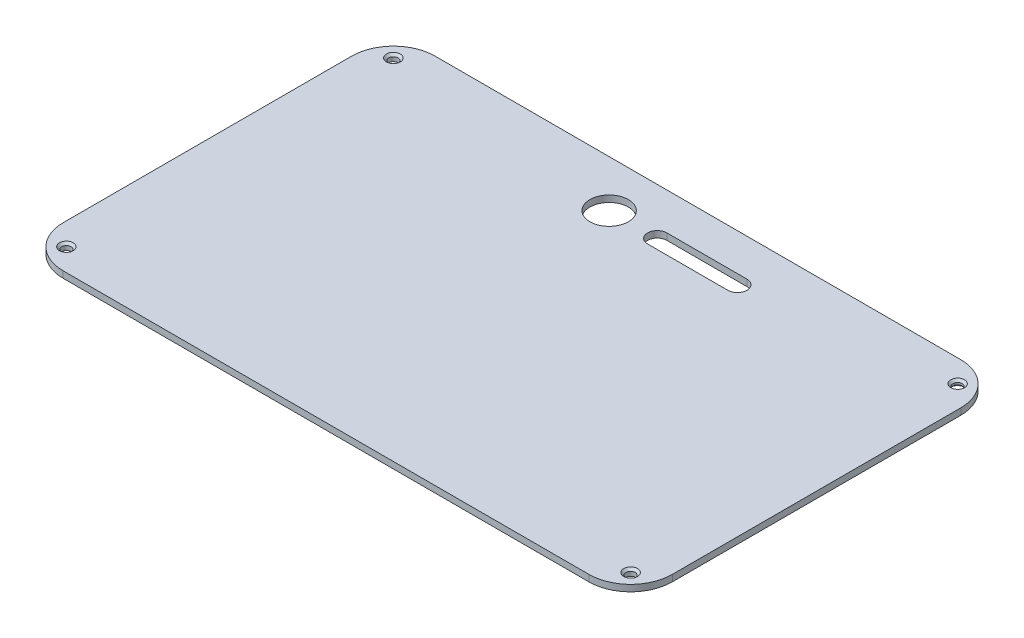
ISO-10303-21;
HEADER;
FILE_DESCRIPTION(('STEP AP214'),'2;1');
FILE_NAME('part.step','',(''),(''),'','','');
FILE_SCHEMA(('AUTOMOTIVE_DESIGN { 1 0 10303 214 1 1 1 1 }'));
ENDSEC;
DATA;
#1=APPLICATION_CONTEXT('core data for automotive mechanical design processes');
#2=APPLICATION_PROTOCOL_DEFINITION('international standard','automotive_design',2000,#1);
#3=PRODUCT_CONTEXT('',#1,'mechanical');
#4=PRODUCT('Part','Part','',(#3));
#5=PRODUCT_RELATED_PRODUCT_CATEGORY('part','',(#4));
#6=PRODUCT_DEFINITION_FORMATION('','',#4);
#7=PRODUCT_DEFINITION_CONTEXT('part definition',#1,'design');
#8=PRODUCT_DEFINITION('design','',#6,#7);
#9=PRODUCT_DEFINITION_SHAPE('','',#8);
#10=(LENGTH_UNIT() NAMED_UNIT(*) SI_UNIT(.MILLI.,.METRE.));
#11=(NAMED_UNIT(*) PLANE_ANGLE_UNIT() SI_UNIT($,.RADIAN.));
#12=(NAMED_UNIT(*) SI_UNIT($,.STERADIAN.) SOLID_ANGLE_UNIT());
#13=UNCERTAINTY_MEASURE_WITH_UNIT(LENGTH_MEASURE(1.E-05),#10,'distance_accuracy_value','');
#14=(GEOMETRIC_REPRESENTATION_CONTEXT(3) GLOBAL_UNCERTAINTY_ASSIGNED_CONTEXT((#13)) GLOBAL_UNIT_ASSIGNED_CONTEXT((#10,
#11,#12)) REPRESENTATION_CONTEXT('',''));
#15=CARTESIAN_POINT('',(0.,0.,0.));
#16=DIRECTION('',(0.,0.,1.));
#17=DIRECTION('',(1.,0.,0.));
#18=AXIS2_PLACEMENT_3D('',#15,#16,#17);
#19=CARTESIAN_POINT('',(-82.,1.016,45.));
#20=DIRECTION('',(0.,-1.,0.));
#21=DIRECTION('',(0.,0.,-1.));
#22=AXIS2_PLACEMENT_3D('',#19,#20,#21);
#23=CYLINDRICAL_SURFACE('',#22,13.);
#24=CARTESIAN_POINT('',(-82.,-1.016,45.));
#25=DIRECTION('',(0.,1.,0.));
#26=DIRECTION('',(0.,0.,-1.));
#27=AXIS2_PLACEMENT_3D('',#24,#25,#26);
#28=CIRCLE('',#27,13.);
#29=CARTESIAN_POINT('',(-95.,-1.016,45.));
#30=VERTEX_POINT('',#29);
#31=CARTESIAN_POINT('',(-82.,-1.016,58.));
#32=VERTEX_POINT('',#31);
#33=EDGE_CURVE('E176',#30,#32,#28,.T.);
#34=ORIENTED_EDGE('',*,*,#33,.T.);
#35=DIRECTION('',(0.,-1.,0.));
#36=VECTOR('',#35,1.);
#37=CARTESIAN_POINT('',(-82.,1.016,58.));
#38=LINE('',#37,#36);
#39=CARTESIAN_POINT('',(-82.,1.016,58.));
#40=VERTEX_POINT('',#39);
#41=EDGE_CURVE('E231',#40,#32,#38,.T.);
#42=ORIENTED_EDGE('',*,*,#41,.F.);
#43=CARTESIAN_POINT('',(-82.,1.016,45.));
#44=DIRECTION('',(0.,1.,0.));
#45=DIRECTION('',(0.,0.,-1.));
#46=AXIS2_PLACEMENT_3D('',#43,#44,#45);
#47=CIRCLE('',#46,13.);
#48=CARTESIAN_POINT('',(-95.,1.016,45.));
#49=VERTEX_POINT('',#48);
#50=EDGE_CURVE('E177',#49,#40,#47,.T.);
#51=ORIENTED_EDGE('',*,*,#50,.F.);
#52=DIRECTION('',(0.,-1.,0.));
#53=VECTOR('',#52,1.);
#54=CARTESIAN_POINT('',(-95.,1.016,45.));
#55=LINE('',#54,#53);
#56=EDGE_CURVE('E195',#49,#30,#55,.T.);
#57=ORIENTED_EDGE('',*,*,#56,.T.);
#58=EDGE_LOOP('',(#34,#42,#51,#57));
#59=FACE_BOUND('',#58,.T.);
#60=ADVANCED_FACE('F35',(#59),#23,.T.);
#61=CARTESIAN_POINT('',(-82.,1.016,58.));
#62=DIRECTION('',(0.,0.,-1.));
#63=DIRECTION('',(-1.,0.,0.));
#64=AXIS2_PLACEMENT_3D('',#61,#62,#63);
#65=PLANE('',#64);
#66=DIRECTION('',(1.,0.,0.));
#67=VECTOR('',#66,1.);
#68=CARTESIAN_POINT('',(-82.,-1.016,58.));
#69=LINE('',#68,#67);
#70=CARTESIAN_POINT('',(82.,-1.016,58.));
#71=VERTEX_POINT('',#70);
#72=EDGE_CURVE('E198',#32,#71,#69,.T.);
#73=ORIENTED_EDGE('',*,*,#72,.T.);
#74=DIRECTION('',(0.,-1.,0.));
#75=VECTOR('',#74,1.);
#76=CARTESIAN_POINT('',(82.,1.016,58.));
#77=LINE('',#76,#75);
#78=CARTESIAN_POINT('',(82.,1.016,58.));
#79=VERTEX_POINT('',#78);
#80=EDGE_CURVE('E228',#79,#71,#77,.T.);
#81=ORIENTED_EDGE('',*,*,#80,.F.);
#82=DIRECTION('',(1.,0.,0.));
#83=VECTOR('',#82,1.);
#84=CARTESIAN_POINT('',(-82.,1.016,58.));
#85=LINE('',#84,#83);
#86=EDGE_CURVE('E180',#40,#79,#85,.T.);
#87=ORIENTED_EDGE('',*,*,#86,.F.);
#88=ORIENTED_EDGE('',*,*,#41,.T.);
#89=EDGE_LOOP('',(#73,#81,#87,#88));
#90=FACE_BOUND('',#89,.T.);
#91=ADVANCED_FACE('F279',(#90),#65,.F.);
#92=CARTESIAN_POINT('',(82.,1.016,45.));
#93=DIRECTION('',(0.,-1.,0.));
#94=DIRECTION('',(0.,0.,-1.));
#95=AXIS2_PLACEMENT_3D('',#92,#93,#94);
#96=CYLINDRICAL_SURFACE('',#95,13.);
#97=CARTESIAN_POINT('',(82.,-1.016,45.));
#98=DIRECTION('',(0.,1.,0.));
#99=DIRECTION('',(0.,0.,1.));
#100=AXIS2_PLACEMENT_3D('',#97,#98,#99);
#101=CIRCLE('',#100,13.);
#102=CARTESIAN_POINT('',(95.,-1.016,45.));
#103=VERTEX_POINT('',#102);
#104=EDGE_CURVE('E200',#71,#103,#101,.T.);
#105=ORIENTED_EDGE('',*,*,#104,.T.);
#106=DIRECTION('',(0.,-1.,0.));
#107=VECTOR('',#106,1.);
#108=CARTESIAN_POINT('',(95.,1.016,45.));
#109=LINE('',#108,#107);
#110=CARTESIAN_POINT('',(95.,1.016,45.));
#111=VERTEX_POINT('',#110);
#112=EDGE_CURVE('E225',#111,#103,#109,.T.);
#113=ORIENTED_EDGE('',*,*,#112,.F.);
#114=CARTESIAN_POINT('',(82.,1.016,45.));
#115=DIRECTION('',(0.,1.,0.));
#116=DIRECTION('',(0.,0.,1.));
#117=AXIS2_PLACEMENT_3D('',#114,#115,#116);
#118=CIRCLE('',#117,13.);
#119=EDGE_CURVE('E183',#79,#111,#118,.T.);
#120=ORIENTED_EDGE('',*,*,#119,.F.);
#121=ORIENTED_EDGE('',*,*,#80,.T.);
#122=EDGE_LOOP('',(#105,#113,#120,#121));
#123=FACE_BOUND('',#122,.T.);
#124=ADVANCED_FACE('F285',(#123),#96,.T.);
#125=CARTESIAN_POINT('',(95.,1.016,45.));
#126=DIRECTION('',(-1.,0.,0.));
#127=DIRECTION('',(0.,0.,1.));
#128=AXIS2_PLACEMENT_3D('',#125,#126,#127);
#129=PLANE('',#128);
#130=DIRECTION('',(0.,0.,-1.));
#131=VECTOR('',#130,1.);
#132=CARTESIAN_POINT('',(95.,-1.016,45.));
#133=LINE('',#132,#131);
#134=CARTESIAN_POINT('',(95.,-1.016,-45.));
#135=VERTEX_POINT('',#134);
#136=EDGE_CURVE('E202',#103,#135,#133,.T.);
#137=ORIENTED_EDGE('',*,*,#136,.T.);
#138=DIRECTION('',(0.,-1.,0.));
#139=VECTOR('',#138,1.);
#140=CARTESIAN_POINT('',(95.,1.016,-45.));
#141=LINE('',#140,#139);
#142=CARTESIAN_POINT('',(95.,1.016,-45.));
#143=VERTEX_POINT('',#142);
#144=EDGE_CURVE('E222',#143,#135,#141,.T.);
#145=ORIENTED_EDGE('',*,*,#144,.F.);
#146=DIRECTION('',(0.,0.,-1.));
#147=VECTOR('',#146,1.);
#148=CARTESIAN_POINT('',(95.,1.016,45.));
#149=LINE('',#148,#147);
#150=EDGE_CURVE('E185',#111,#143,#149,.T.);
#151=ORIENTED_EDGE('',*,*,#150,.F.);
#152=ORIENTED_EDGE('',*,*,#112,.T.);
#153=EDGE_LOOP('',(#137,#145,#151,#152));
#154=FACE_BOUND('',#153,.T.);
#155=ADVANCED_FACE('F355',(#154),#129,.F.);
#156=CARTESIAN_POINT('',(82.,1.016,-45.));
#157=DIRECTION('',(0.,-1.,0.));
#158=DIRECTION('',(0.,0.,-1.));
#159=AXIS2_PLACEMENT_3D('',#156,#157,#158);
#160=CYLINDRICAL_SURFACE('',#159,13.);
#161=CARTESIAN_POINT('',(82.,-1.016,-45.));
#162=DIRECTION('',(0.,1.,0.));
#163=DIRECTION('',(0.,0.,-1.));
#164=AXIS2_PLACEMENT_3D('',#161,#162,#163);
#165=CIRCLE('',#164,13.);
#166=CARTESIAN_POINT('',(82.,-1.016,-58.));
#167=VERTEX_POINT('',#166);
#168=EDGE_CURVE('E204',#135,#167,#165,.T.);
#169=ORIENTED_EDGE('',*,*,#168,.T.);
#170=DIRECTION('',(0.,-1.,0.));
#171=VECTOR('',#170,1.);
#172=CARTESIAN_POINT('',(82.,1.016,-58.));
#173=LINE('',#172,#171);
#174=CARTESIAN_POINT('',(82.,1.016,-58.));
#175=VERTEX_POINT('',#174);
#176=EDGE_CURVE('E219',#175,#167,#173,.T.);
#177=ORIENTED_EDGE('',*,*,#176,.F.);
#178=CARTESIAN_POINT('',(82.,1.016,-45.));
#179=DIRECTION('',(0.,1.,0.));
#180=DIRECTION('',(0.,0.,-1.));
#181=AXIS2_PLACEMENT_3D('',#178,#179,#180);
#182=CIRCLE('',#181,13.);
#183=EDGE_CURVE('E187',#143,#175,#182,.T.);
#184=ORIENTED_EDGE('',*,*,#183,.F.);
#185=ORIENTED_EDGE('',*,*,#144,.T.);
#186=EDGE_LOOP('',(#169,#177,#184,#185));
#187=FACE_BOUND('',#186,.T.);
#188=ADVANCED_FACE('F351',(#187),#160,.T.);
#189=CARTESIAN_POINT('',(-82.,1.016,-58.));
#190=DIRECTION('',(0.,0.,1.));
#191=DIRECTION('',(1.,0.,0.));
#192=AXIS2_PLACEMENT_3D('',#189,#190,#191);
#193=PLANE('',#192);
#194=DIRECTION('',(-1.,0.,0.));
#195=VECTOR('',#194,1.);
#196=CARTESIAN_POINT('',(-82.,-1.016,-58.));
#197=LINE('',#196,#195);
#198=CARTESIAN_POINT('',(-82.,-1.016,-58.));
#199=VERTEX_POINT('',#198);
#200=EDGE_CURVE('E206',#167,#199,#197,.T.);
#201=ORIENTED_EDGE('',*,*,#200,.T.);
#202=DIRECTION('',(0.,-1.,0.));
#203=VECTOR('',#202,1.);
#204=CARTESIAN_POINT('',(-82.,1.016,-58.));
#205=LINE('',#204,#203);
#206=CARTESIAN_POINT('',(-82.,1.016,-58.));
#207=VERTEX_POINT('',#206);
#208=EDGE_CURVE('E216',#207,#199,#205,.T.);
#209=ORIENTED_EDGE('',*,*,#208,.F.);
#210=DIRECTION('',(-1.,0.,0.));
#211=VECTOR('',#210,1.);
#212=CARTESIAN_POINT('',(-82.,1.016,-58.));
#213=LINE('',#212,#211);
#214=EDGE_CURVE('E189',#175,#207,#213,.T.);
#215=ORIENTED_EDGE('',*,*,#214,.F.);
#216=ORIENTED_EDGE('',*,*,#176,.T.);
#217=EDGE_LOOP('',(#201,#209,#215,#216));
#218=FACE_BOUND('',#217,.T.);
#219=ADVANCED_FACE('F346',(#218),#193,.F.);
#220=CARTESIAN_POINT('',(-82.,1.016,-45.));
#221=DIRECTION('',(0.,-1.,0.));
#222=DIRECTION('',(0.,0.,-1.));
#223=AXIS2_PLACEMENT_3D('',#220,#221,#222);
#224=CYLINDRICAL_SURFACE('',#223,13.);
#225=CARTESIAN_POINT('',(-82.,-1.016,-45.));
#226=DIRECTION('',(0.,1.,0.));
#227=DIRECTION('',(0.,0.,-1.));
#228=AXIS2_PLACEMENT_3D('',#225,#226,#227);
#229=CIRCLE('',#228,13.);
#230=CARTESIAN_POINT('',(-95.,-1.016,-45.));
#231=VERTEX_POINT('',#230);
#232=EDGE_CURVE('E208',#199,#231,#229,.T.);
#233=ORIENTED_EDGE('',*,*,#232,.T.);
#234=DIRECTION('',(0.,-1.,0.));
#235=VECTOR('',#234,1.);
#236=CARTESIAN_POINT('',(-95.,1.016,-45.));
#237=LINE('',#236,#235);
#238=CARTESIAN_POINT('',(-95.,1.016,-45.));
#239=VERTEX_POINT('',#238);
#240=EDGE_CURVE('E213',#239,#231,#237,.T.);
#241=ORIENTED_EDGE('',*,*,#240,.F.);
#242=CARTESIAN_POINT('',(-82.,1.016,-45.));
#243=DIRECTION('',(0.,1.,0.));
#244=DIRECTION('',(0.,0.,-1.));
#245=AXIS2_PLACEMENT_3D('',#242,#243,#244);
#246=CIRCLE('',#245,13.);
#247=EDGE_CURVE('E191',#207,#239,#246,.T.);
#248=ORIENTED_EDGE('',*,*,#247,.F.);
#249=ORIENTED_EDGE('',*,*,#208,.T.);
#250=EDGE_LOOP('',(#233,#241,#248,#249));
#251=FACE_BOUND('',#250,.T.);
#252=ADVANCED_FACE('F340',(#251),#224,.T.);
#253=CARTESIAN_POINT('',(-95.,1.016,45.));
#254=DIRECTION('',(1.,0.,0.));
#255=DIRECTION('',(0.,0.,-1.));
#256=AXIS2_PLACEMENT_3D('',#253,#254,#255);
#257=PLANE('',#256);
#258=DIRECTION('',(0.,0.,1.));
#259=VECTOR('',#258,1.);
#260=CARTESIAN_POINT('',(-95.,-1.016,45.));
#261=LINE('',#260,#259);
#262=EDGE_CURVE('E181',#231,#30,#261,.T.);
#263=ORIENTED_EDGE('',*,*,#262,.T.);
#264=ORIENTED_EDGE('',*,*,#56,.F.);
#265=DIRECTION('',(0.,0.,1.));
#266=VECTOR('',#265,1.);
#267=CARTESIAN_POINT('',(-95.,1.016,45.));
#268=LINE('',#267,#266);
#269=EDGE_CURVE('E193',#239,#49,#268,.T.);
#270=ORIENTED_EDGE('',*,*,#269,.F.);
#271=ORIENTED_EDGE('',*,*,#240,.T.);
#272=EDGE_LOOP('',(#263,#264,#270,#271));
#273=FACE_BOUND('',#272,.T.);
#274=ADVANCED_FACE('F336',(#273),#257,.F.);
#275=CARTESIAN_POINT('',(-82.,1.016,45.));
#276=DIRECTION('',(0.,-1.,0.));
#277=DIRECTION('',(0.,0.,-1.));
#278=AXIS2_PLACEMENT_3D('',#275,#276,#277);
#279=PLANE('',#278);
#280=DIRECTION('',(1.,0.,0.));
#281=VECTOR('',#280,1.);
#282=CARTESIAN_POINT('',(1.89999999999971,1.016,-40.4));
#283=LINE('',#282,#281);
#284=CARTESIAN_POINT('',(1.89999999999971,1.016,-40.4));
#285=VERTEX_POINT('',#284);
#286=CARTESIAN_POINT('',(26.8999999999997,1.016,-40.4));
#287=VERTEX_POINT('',#286);
#288=EDGE_CURVE('E152',#285,#287,#283,.T.);
#289=ORIENTED_EDGE('',*,*,#288,.F.);
#290=CARTESIAN_POINT('',(1.89999999999971,1.016,-43.4));
#291=DIRECTION('',(0.,1.,0.));
#292=DIRECTION('',(0.,0.,1.));
#293=AXIS2_PLACEMENT_3D('',#290,#291,#292);
#294=CIRCLE('',#293,3.);
#295=CARTESIAN_POINT('',(1.89999999999971,1.016,-46.4));
#296=VERTEX_POINT('',#295);
#297=EDGE_CURVE('E51',#296,#285,#294,.T.);
#298=ORIENTED_EDGE('',*,*,#297,.F.);
#299=DIRECTION('',(-1.,0.,0.));
#300=VECTOR('',#299,1.);
#301=CARTESIAN_POINT('',(1.89999999999971,1.016,-46.4));
#302=LINE('',#301,#300);
#303=CARTESIAN_POINT('',(26.8999999999997,1.016,-46.4));
#304=VERTEX_POINT('',#303);
#305=EDGE_CURVE('E143',#304,#296,#302,.T.);
#306=ORIENTED_EDGE('',*,*,#305,.F.);
#307=CARTESIAN_POINT('',(26.8999999999997,1.016,-43.4));
#308=DIRECTION('',(0.,1.,0.));
#309=DIRECTION('',(0.,0.,1.));
#310=AXIS2_PLACEMENT_3D('',#307,#308,#309);
#311=CIRCLE('',#310,3.);
#312=EDGE_CURVE('E146',#287,#304,#311,.T.);
#313=ORIENTED_EDGE('',*,*,#312,.F.);
#314=EDGE_LOOP('',(#289,#298,#306,#313));
#315=FACE_BOUND('',#314,.T.);
#316=CARTESIAN_POINT('',(-13.1000000000003,1.016,-43.4));
#317=DIRECTION('',(0.,1.,0.));
#318=DIRECTION('',(0.,0.,1.));
#319=AXIS2_PLACEMENT_3D('',#316,#317,#318);
#320=CIRCLE('',#319,6.);
#321=CARTESIAN_POINT('',(-13.1000000000003,1.016,-37.4));
#322=VERTEX_POINT('',#321);
#323=EDGE_CURVE('E158',#322,#322,#320,.T.);
#324=ORIENTED_EDGE('',*,*,#323,.F.);
#325=EDGE_LOOP('',(#324));
#326=FACE_BOUND('',#325,.T.);
#327=CARTESIAN_POINT('',(88.,1.016,-51.));
#328=DIRECTION('',(0.,-1.,0.));
#329=DIRECTION('',(0.,0.,-1.));
#330=AXIS2_PLACEMENT_3D('',#327,#328,#329);
#331=CIRCLE('',#330,2.14999999999993);
#332=CARTESIAN_POINT('',(88.,1.016,-53.15));
#333=VERTEX_POINT('',#332);
#334=EDGE_CURVE('E249',#333,#333,#331,.T.);
#335=ORIENTED_EDGE('',*,*,#334,.T.);
#336=EDGE_LOOP('',(#335));
#337=FACE_BOUND('',#336,.T.);
#338=CARTESIAN_POINT('',(88.,1.016,50.9999999999999));
#339=DIRECTION('',(0.,-1.,0.));
#340=DIRECTION('',(0.,0.,-1.));
#341=AXIS2_PLACEMENT_3D('',#338,#339,#340);
#342=CIRCLE('',#341,2.14999999999993);
#343=CARTESIAN_POINT('',(88.,1.016,48.85));
#344=VERTEX_POINT('',#343);
#345=EDGE_CURVE('E246',#344,#344,#342,.T.);
#346=ORIENTED_EDGE('',*,*,#345,.T.);
#347=EDGE_LOOP('',(#346));
#348=FACE_BOUND('',#347,.T.);
#349=CARTESIAN_POINT('',(-88.,1.016,-51.));
#350=DIRECTION('',(0.,-1.,0.));
#351=DIRECTION('',(0.,0.,-1.));
#352=AXIS2_PLACEMENT_3D('',#349,#350,#351);
#353=CIRCLE('',#352,2.14999999999993);
#354=CARTESIAN_POINT('',(-88.,1.016,-53.15));
#355=VERTEX_POINT('',#354);
#356=EDGE_CURVE('E243',#355,#355,#353,.T.);
#357=ORIENTED_EDGE('',*,*,#356,.T.);
#358=EDGE_LOOP('',(#357));
#359=FACE_BOUND('',#358,.T.);
#360=CARTESIAN_POINT('',(-88.,1.016,51.));
#361=DIRECTION('',(0.,-1.,0.));
#362=DIRECTION('',(0.,0.,-1.));
#363=AXIS2_PLACEMENT_3D('',#360,#361,#362);
#364=CIRCLE('',#363,2.14999999999993);
#365=CARTESIAN_POINT('',(-88.,1.016,48.8500000000001));
#366=VERTEX_POINT('',#365);
#367=EDGE_CURVE('E240',#366,#366,#364,.T.);
#368=ORIENTED_EDGE('',*,*,#367,.T.);
#369=EDGE_LOOP('',(#368));
#370=FACE_BOUND('',#369,.T.);
#371=ORIENTED_EDGE('',*,*,#50,.T.);
#372=ORIENTED_EDGE('',*,*,#86,.T.);
#373=ORIENTED_EDGE('',*,*,#119,.T.);
#374=ORIENTED_EDGE('',*,*,#150,.T.);
#375=ORIENTED_EDGE('',*,*,#183,.T.);
#376=ORIENTED_EDGE('',*,*,#214,.T.);
#377=ORIENTED_EDGE('',*,*,#247,.T.);
#378=ORIENTED_EDGE('',*,*,#269,.T.);
#379=EDGE_LOOP('',(#371,#372,#373,#374,#375,#376,#377,#378));
#380=FACE_BOUND('',#379,.T.);
#381=ADVANCED_FACE('F319',(#315,#326,#337,#348,#359,#370,#380),#279,.F.);
#382=CARTESIAN_POINT('',(-82.,-1.016,45.));
#383=DIRECTION('',(0.,-1.,0.));
#384=DIRECTION('',(0.,0.,-1.));
#385=AXIS2_PLACEMENT_3D('',#382,#383,#384);
#386=PLANE('',#385);
#387=CARTESIAN_POINT('',(1.89999999999971,-1.016,-43.4));
#388=DIRECTION('',(0.,1.,0.));
#389=DIRECTION('',(0.,0.,1.));
#390=AXIS2_PLACEMENT_3D('',#387,#388,#389);
#391=CIRCLE('',#390,3.);
#392=CARTESIAN_POINT('',(1.89999999999971,-1.016,-46.4));
#393=VERTEX_POINT('',#392);
#394=CARTESIAN_POINT('',(1.89999999999971,-1.016,-40.4));
#395=VERTEX_POINT('',#394);
#396=EDGE_CURVE('E127',#393,#395,#391,.T.);
#397=ORIENTED_EDGE('',*,*,#396,.T.);
#398=DIRECTION('',(1.,0.,0.));
#399=VECTOR('',#398,1.);
#400=CARTESIAN_POINT('',(1.89999999999971,-1.016,-40.4));
#401=LINE('',#400,#399);
#402=CARTESIAN_POINT('',(26.8999999999997,-1.016,-40.4));
#403=VERTEX_POINT('',#402);
#404=EDGE_CURVE('E136',#395,#403,#401,.T.);
#405=ORIENTED_EDGE('',*,*,#404,.T.);
#406=CARTESIAN_POINT('',(26.8999999999997,-1.016,-43.4));
#407=DIRECTION('',(0.,1.,0.));
#408=DIRECTION('',(0.,0.,1.));
#409=AXIS2_PLACEMENT_3D('',#406,#407,#408);
#410=CIRCLE('',#409,3.);
#411=CARTESIAN_POINT('',(26.8999999999997,-1.016,-46.4));
#412=VERTEX_POINT('',#411);
#413=EDGE_CURVE('E59',#403,#412,#410,.T.);
#414=ORIENTED_EDGE('',*,*,#413,.T.);
#415=DIRECTION('',(-1.,0.,0.));
#416=VECTOR('',#415,1.);
#417=CARTESIAN_POINT('',(1.89999999999971,-1.016,-46.4));
#418=LINE('',#417,#416);
#419=EDGE_CURVE('E133',#412,#393,#418,.T.);
#420=ORIENTED_EDGE('',*,*,#419,.T.);
#421=EDGE_LOOP('',(#397,#405,#414,#420));
#422=FACE_BOUND('',#421,.T.);
#423=CARTESIAN_POINT('',(-13.1000000000003,-1.016,-43.4));
#424=DIRECTION('',(0.,1.,0.));
#425=DIRECTION('',(0.,0.,1.));
#426=AXIS2_PLACEMENT_3D('',#423,#424,#425);
#427=CIRCLE('',#426,6.);
#428=CARTESIAN_POINT('',(-13.1000000000003,-1.016,-37.4));
#429=VERTEX_POINT('',#428);
#430=EDGE_CURVE('E162',#429,#429,#427,.T.);
#431=ORIENTED_EDGE('',*,*,#430,.T.);
#432=EDGE_LOOP('',(#431));
#433=FACE_BOUND('',#432,.T.);
#434=CARTESIAN_POINT('',(88.,-1.016,-51.));
#435=DIRECTION('',(0.,-1.,0.));
#436=DIRECTION('',(0.,0.,-1.));
#437=AXIS2_PLACEMENT_3D('',#434,#435,#436);
#438=CIRCLE('',#437,2.15000000000001);
#439=CARTESIAN_POINT('',(88.,-1.016,-53.1500000000001));
#440=VERTEX_POINT('',#439);
#441=EDGE_CURVE('E252',#440,#440,#438,.F.);
#442=ORIENTED_EDGE('',*,*,#441,.T.);
#443=EDGE_LOOP('',(#442));
#444=FACE_BOUND('',#443,.T.);
#445=CARTESIAN_POINT('',(-88.,-1.016,51.));
#446=DIRECTION('',(0.,1.,0.));
#447=DIRECTION('',(0.,0.,1.));
#448=AXIS2_PLACEMENT_3D('',#445,#446,#447);
#449=CIRCLE('',#448,1.44999999999999);
#450=CARTESIAN_POINT('',(-88.,-1.016,52.45));
#451=VERTEX_POINT('',#450);
#452=EDGE_CURVE('E165',#451,#451,#449,.T.);
#453=ORIENTED_EDGE('',*,*,#452,.T.);
#454=EDGE_LOOP('',(#453));
#455=FACE_BOUND('',#454,.T.);
#456=CARTESIAN_POINT('',(-88.,-1.016,-51.));
#457=DIRECTION('',(0.,1.,0.));
#458=DIRECTION('',(0.,0.,1.));
#459=AXIS2_PLACEMENT_3D('',#456,#457,#458);
#460=CIRCLE('',#459,1.44999999999999);
#461=CARTESIAN_POINT('',(-88.,-1.016,-49.55));
#462=VERTEX_POINT('',#461);
#463=EDGE_CURVE('E170',#462,#462,#460,.T.);
#464=ORIENTED_EDGE('',*,*,#463,.T.);
#465=EDGE_LOOP('',(#464));
#466=FACE_BOUND('',#465,.T.);
#467=CARTESIAN_POINT('',(88.,-1.016,50.9999999999999));
#468=DIRECTION('',(0.,1.,0.));
#469=DIRECTION('',(0.,0.,1.));
#470=AXIS2_PLACEMENT_3D('',#467,#468,#469);
#471=CIRCLE('',#470,1.44999999999999);
#472=CARTESIAN_POINT('',(88.,-1.016,52.4499999999999));
#473=VERTEX_POINT('',#472);
#474=EDGE_CURVE('E173',#473,#473,#471,.T.);
#475=ORIENTED_EDGE('',*,*,#474,.T.);
#476=EDGE_LOOP('',(#475));
#477=FACE_BOUND('',#476,.T.);
#478=ORIENTED_EDGE('',*,*,#33,.F.);
#479=ORIENTED_EDGE('',*,*,#262,.F.);
#480=ORIENTED_EDGE('',*,*,#232,.F.);
#481=ORIENTED_EDGE('',*,*,#200,.F.);
#482=ORIENTED_EDGE('',*,*,#168,.F.);
#483=ORIENTED_EDGE('',*,*,#136,.F.);
#484=ORIENTED_EDGE('',*,*,#104,.F.);
#485=ORIENTED_EDGE('',*,*,#72,.F.);
#486=EDGE_LOOP('',(#478,#479,#480,#481,#482,#483,#484,#485));
#487=FACE_BOUND('',#486,.T.);
#488=ADVANCED_FACE('F140',(#422,#433,#444,#455,#466,#477,#487),#386,.T.);
#489=CARTESIAN_POINT('',(88.,1.016,-51.));
#490=DIRECTION('',(0.,1.,0.));
#491=DIRECTION('',(0.,0.,1.));
#492=AXIS2_PLACEMENT_3D('',#489,#490,#491);
#493=CYLINDRICAL_SURFACE('',#492,1.44999999999999);
#494=CARTESIAN_POINT('',(88.,0.316000000000058,-51.));
#495=DIRECTION('',(0.,-1.,0.));
#496=DIRECTION('',(0.,0.,-1.));
#497=AXIS2_PLACEMENT_3D('',#494,#495,#496);
#498=CIRCLE('',#497,1.44999999999999);
#499=CARTESIAN_POINT('',(88.,0.316000000000058,-52.45));
#500=VERTEX_POINT('',#499);
#501=EDGE_CURVE('E237',#500,#500,#498,.F.);
#502=ORIENTED_EDGE('',*,*,#501,.T.);
#503=EDGE_LOOP('',(#502));
#504=FACE_BOUND('',#503,.T.);
#505=CARTESIAN_POINT('',(88.,-0.315999999999975,-51.));
#506=DIRECTION('',(0.,-1.,0.));
#507=DIRECTION('',(0.,0.,-1.));
#508=AXIS2_PLACEMENT_3D('',#505,#506,#507);
#509=CIRCLE('',#508,1.44999999999999);
#510=CARTESIAN_POINT('',(88.,-0.315999999999975,-52.45));
#511=VERTEX_POINT('',#510);
#512=EDGE_CURVE('E234',#511,#511,#509,.T.);
#513=ORIENTED_EDGE('',*,*,#512,.T.);
#514=EDGE_LOOP('',(#513));
#515=FACE_BOUND('',#514,.T.);
#516=ADVANCED_FACE('F318',(#504,#515),#493,.F.);
#517=CARTESIAN_POINT('',(88.,1.016,50.9999999999999));
#518=DIRECTION('',(0.,1.,0.));
#519=DIRECTION('',(0.,0.,1.));
#520=AXIS2_PLACEMENT_3D('',#517,#518,#519);
#521=CYLINDRICAL_SURFACE('',#520,1.44999999999999);
#522=CARTESIAN_POINT('',(88.,0.316000000000058,50.9999999999999));
#523=DIRECTION('',(0.,-1.,0.));
#524=DIRECTION('',(0.,0.,-1.));
#525=AXIS2_PLACEMENT_3D('',#522,#523,#524);
#526=CIRCLE('',#525,1.44999999999999);
#527=CARTESIAN_POINT('',(88.,0.316000000000058,49.5499999999999));
#528=VERTEX_POINT('',#527);
#529=EDGE_CURVE('E255',#528,#528,#526,.F.);
#530=ORIENTED_EDGE('',*,*,#529,.T.);
#531=EDGE_LOOP('',(#530));
#532=FACE_BOUND('',#531,.T.);
#533=ORIENTED_EDGE('',*,*,#474,.F.);
#534=EDGE_LOOP('',(#533));
#535=FACE_BOUND('',#534,.T.);
#536=ADVANCED_FACE('F414',(#532,#535),#521,.F.);
#537=CARTESIAN_POINT('',(-88.,1.016,-51.));
#538=DIRECTION('',(0.,1.,0.));
#539=DIRECTION('',(0.,0.,1.));
#540=AXIS2_PLACEMENT_3D('',#537,#538,#539);
#541=CYLINDRICAL_SURFACE('',#540,1.44999999999999);
#542=CARTESIAN_POINT('',(-88.,0.316000000000058,-51.));
#543=DIRECTION('',(0.,-1.,0.));
#544=DIRECTION('',(0.,0.,-1.));
#545=AXIS2_PLACEMENT_3D('',#542,#543,#544);
#546=CIRCLE('',#545,1.44999999999999);
#547=CARTESIAN_POINT('',(-88.,0.316000000000058,-52.45));
#548=VERTEX_POINT('',#547);
#549=EDGE_CURVE('E44',#548,#548,#546,.F.);
#550=ORIENTED_EDGE('',*,*,#549,.T.);
#551=EDGE_LOOP('',(#550));
#552=FACE_BOUND('',#551,.T.);
#553=ORIENTED_EDGE('',*,*,#463,.F.);
#554=EDGE_LOOP('',(#553));
#555=FACE_BOUND('',#554,.T.);
#556=ADVANCED_FACE('F260',(#552,#555),#541,.F.);
#557=CARTESIAN_POINT('',(-88.,1.016,51.));
#558=DIRECTION('',(0.,1.,0.));
#559=DIRECTION('',(0.,0.,1.));
#560=AXIS2_PLACEMENT_3D('',#557,#558,#559);
#561=CYLINDRICAL_SURFACE('',#560,1.44999999999999);
#562=CARTESIAN_POINT('',(-88.,0.316000000000058,51.));
#563=DIRECTION('',(0.,-1.,0.));
#564=DIRECTION('',(0.,0.,-1.));
#565=AXIS2_PLACEMENT_3D('',#562,#563,#564);
#566=CIRCLE('',#565,1.44999999999999);
#567=CARTESIAN_POINT('',(-88.,0.316000000000058,49.55));
#568=VERTEX_POINT('',#567);
#569=EDGE_CURVE('E11',#568,#568,#566,.F.);
#570=ORIENTED_EDGE('',*,*,#569,.T.);
#571=EDGE_LOOP('',(#570));
#572=FACE_BOUND('',#571,.T.);
#573=ORIENTED_EDGE('',*,*,#452,.F.);
#574=EDGE_LOOP('',(#573));
#575=FACE_BOUND('',#574,.T.);
#576=ADVANCED_FACE('F297',(#572,#575),#561,.F.);
#577=CARTESIAN_POINT('',(88.,0.316000000000058,-51.));
#578=DIRECTION('',(0.,1.,0.));
#579=DIRECTION('',(0.,0.,1.));
#580=AXIS2_PLACEMENT_3D('',#577,#578,#579);
#581=CONICAL_SURFACE('',#580,1.44999999999999,0.785398163397445);
#582=ORIENTED_EDGE('',*,*,#334,.F.);
#583=EDGE_LOOP('',(#582));
#584=FACE_BOUND('',#583,.T.);
#585=ORIENTED_EDGE('',*,*,#501,.F.);
#586=EDGE_LOOP('',(#585));
#587=FACE_BOUND('',#586,.T.);
#588=ADVANCED_FACE('F291',(#584,#587),#581,.F.);
#589=CARTESIAN_POINT('',(88.,-1.016,-51.));
#590=DIRECTION('',(0.,-1.,0.));
#591=DIRECTION('',(0.,0.,-1.));
#592=AXIS2_PLACEMENT_3D('',#589,#590,#591);
#593=CONICAL_SURFACE('',#592,2.15000000000001,0.785398163397445);
#594=ORIENTED_EDGE('',*,*,#512,.F.);
#595=EDGE_LOOP('',(#594));
#596=FACE_BOUND('',#595,.T.);
#597=ORIENTED_EDGE('',*,*,#441,.F.);
#598=EDGE_LOOP('',(#597));
#599=FACE_BOUND('',#598,.T.);
#600=ADVANCED_FACE('F273',(#596,#599),#593,.F.);
#601=CARTESIAN_POINT('',(88.,0.316000000000058,50.9999999999999));
#602=DIRECTION('',(0.,1.,0.));
#603=DIRECTION('',(0.,0.,1.));
#604=AXIS2_PLACEMENT_3D('',#601,#602,#603);
#605=CONICAL_SURFACE('',#604,1.44999999999999,0.785398163397445);
#606=ORIENTED_EDGE('',*,*,#345,.F.);
#607=EDGE_LOOP('',(#606));
#608=FACE_BOUND('',#607,.T.);
#609=ORIENTED_EDGE('',*,*,#529,.F.);
#610=EDGE_LOOP('',(#609));
#611=FACE_BOUND('',#610,.T.);
#612=ADVANCED_FACE('F265',(#608,#611),#605,.F.);
#613=CARTESIAN_POINT('',(-88.,0.316000000000058,-51.));
#614=DIRECTION('',(0.,1.,0.));
#615=DIRECTION('',(0.,0.,1.));
#616=AXIS2_PLACEMENT_3D('',#613,#614,#615);
#617=CONICAL_SURFACE('',#616,1.44999999999999,0.785398163397445);
#618=ORIENTED_EDGE('',*,*,#356,.F.);
#619=EDGE_LOOP('',(#618));
#620=FACE_BOUND('',#619,.T.);
#621=ORIENTED_EDGE('',*,*,#549,.F.);
#622=EDGE_LOOP('',(#621));
#623=FACE_BOUND('',#622,.T.);
#624=ADVANCED_FACE('F263',(#620,#623),#617,.F.);
#625=CARTESIAN_POINT('',(-88.,0.316000000000058,51.));
#626=DIRECTION('',(0.,1.,0.));
#627=DIRECTION('',(0.,0.,1.));
#628=AXIS2_PLACEMENT_3D('',#625,#626,#627);
#629=CONICAL_SURFACE('',#628,1.44999999999999,0.785398163397445);
#630=ORIENTED_EDGE('',*,*,#367,.F.);
#631=EDGE_LOOP('',(#630));
#632=FACE_BOUND('',#631,.T.);
#633=ORIENTED_EDGE('',*,*,#569,.F.);
#634=EDGE_LOOP('',(#633));
#635=FACE_BOUND('',#634,.T.);
#636=ADVANCED_FACE('F38',(#632,#635),#629,.F.);
#637=CARTESIAN_POINT('',(-13.1000000000003,-1.016,-43.4));
#638=DIRECTION('',(0.,1.,0.));
#639=DIRECTION('',(0.,0.,1.));
#640=AXIS2_PLACEMENT_3D('',#637,#638,#639);
#641=CYLINDRICAL_SURFACE('',#640,6.);
#642=ORIENTED_EDGE('',*,*,#430,.F.);
#643=EDGE_LOOP('',(#642));
#644=FACE_BOUND('',#643,.T.);
#645=ORIENTED_EDGE('',*,*,#323,.T.);
#646=EDGE_LOOP('',(#645));
#647=FACE_BOUND('',#646,.T.);
#648=ADVANCED_FACE('F271',(#644,#647),#641,.F.);
#649=CARTESIAN_POINT('',(1.89999999999971,-1.016,-43.4));
#650=DIRECTION('',(0.,1.,0.));
#651=DIRECTION('',(0.,0.,1.));
#652=AXIS2_PLACEMENT_3D('',#649,#650,#651);
#653=CYLINDRICAL_SURFACE('',#652,3.);
#654=ORIENTED_EDGE('',*,*,#297,.T.);
#655=DIRECTION('',(0.,1.,0.));
#656=VECTOR('',#655,1.);
#657=CARTESIAN_POINT('',(1.89999999999971,-1.016,-40.4));
#658=LINE('',#657,#656);
#659=EDGE_CURVE('E123',#395,#285,#658,.T.);
#660=ORIENTED_EDGE('',*,*,#659,.F.);
#661=ORIENTED_EDGE('',*,*,#396,.F.);
#662=DIRECTION('',(0.,1.,0.));
#663=VECTOR('',#662,1.);
#664=CARTESIAN_POINT('',(1.89999999999971,-1.016,-46.4));
#665=LINE('',#664,#663);
#666=EDGE_CURVE('E156',#393,#296,#665,.T.);
#667=ORIENTED_EDGE('',*,*,#666,.T.);
#668=EDGE_LOOP('',(#654,#660,#661,#667));
#669=FACE_BOUND('',#668,.T.);
#670=ADVANCED_FACE('F125',(#669),#653,.F.);
#671=CARTESIAN_POINT('',(1.89999999999971,-1.016,-46.4));
#672=DIRECTION('',(0.,0.,-1.));
#673=DIRECTION('',(-1.,0.,0.));
#674=AXIS2_PLACEMENT_3D('',#671,#672,#673);
#675=PLANE('',#674);
#676=ORIENTED_EDGE('',*,*,#305,.T.);
#677=ORIENTED_EDGE('',*,*,#666,.F.);
#678=ORIENTED_EDGE('',*,*,#419,.F.);
#679=DIRECTION('',(0.,1.,0.));
#680=VECTOR('',#679,1.);
#681=CARTESIAN_POINT('',(26.8999999999997,-1.016,-46.4));
#682=LINE('',#681,#680);
#683=EDGE_CURVE('E159',#412,#304,#682,.T.);
#684=ORIENTED_EDGE('',*,*,#683,.T.);
#685=EDGE_LOOP('',(#676,#677,#678,#684));
#686=FACE_BOUND('',#685,.T.);
#687=ADVANCED_FACE('F492',(#686),#675,.F.);
#688=CARTESIAN_POINT('',(26.8999999999997,-1.016,-43.4));
#689=DIRECTION('',(0.,1.,0.));
#690=DIRECTION('',(0.,0.,1.));
#691=AXIS2_PLACEMENT_3D('',#688,#689,#690);
#692=CYLINDRICAL_SURFACE('',#691,3.);
#693=ORIENTED_EDGE('',*,*,#312,.T.);
#694=ORIENTED_EDGE('',*,*,#683,.F.);
#695=ORIENTED_EDGE('',*,*,#413,.F.);
#696=DIRECTION('',(0.,1.,0.));
#697=VECTOR('',#696,1.);
#698=CARTESIAN_POINT('',(26.8999999999997,-1.016,-40.4));
#699=LINE('',#698,#697);
#700=EDGE_CURVE('E132',#403,#287,#699,.T.);
#701=ORIENTED_EDGE('',*,*,#700,.T.);
#702=EDGE_LOOP('',(#693,#694,#695,#701));
#703=FACE_BOUND('',#702,.T.);
#704=ADVANCED_FACE('F501',(#703),#692,.F.);
#705=CARTESIAN_POINT('',(1.89999999999971,-1.016,-40.4));
#706=DIRECTION('',(0.,0.,1.));
#707=DIRECTION('',(1.,0.,0.));
#708=AXIS2_PLACEMENT_3D('',#705,#706,#707);
#709=PLANE('',#708);
#710=ORIENTED_EDGE('',*,*,#288,.T.);
#711=ORIENTED_EDGE('',*,*,#700,.F.);
#712=ORIENTED_EDGE('',*,*,#404,.F.);
#713=ORIENTED_EDGE('',*,*,#659,.T.);
#714=EDGE_LOOP('',(#710,#711,#712,#713));
#715=FACE_BOUND('',#714,.T.);
#716=ADVANCED_FACE('F137',(#715),#709,.F.);
#717=CLOSED_SHELL('',(#60,#91,#124,#155,#188,#219,#252,#274,#381,#488,#516,#536,#556,#576,#588,
#600,#612,#624,#636,#648,#670,#687,#704,#716));
#718=MANIFOLD_SOLID_BREP('B2',#717);
#719=ADVANCED_BREP_SHAPE_REPRESENTATION('',(#18,#718),#14);
#720=SHAPE_DEFINITION_REPRESENTATION(#9,#719);
ENDSEC;
END-ISO-10303-21;
